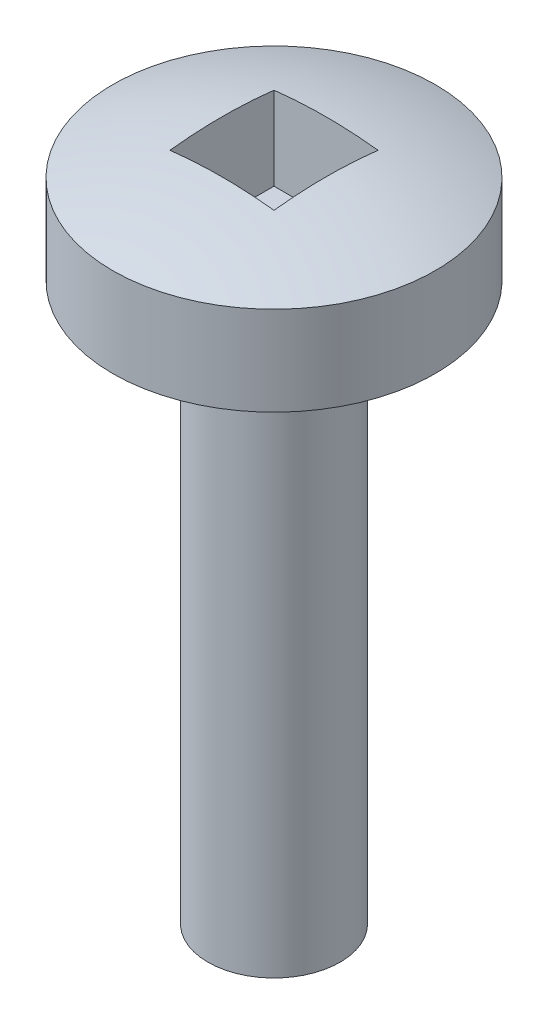
ISO-10303-21;
HEADER;
FILE_DESCRIPTION(('STEP AP214'),'2;1');
FILE_NAME('part.step','',(''),(''),'','','');
FILE_SCHEMA(('AUTOMOTIVE_DESIGN { 1 0 10303 214 1 1 1 1 }'));
ENDSEC;
DATA;
#1=APPLICATION_CONTEXT('core data for automotive mechanical design processes');
#2=APPLICATION_PROTOCOL_DEFINITION('international standard','automotive_design',2000,#1);
#3=PRODUCT_CONTEXT('',#1,'mechanical');
#4=PRODUCT('Part','Part','',(#3));
#5=PRODUCT_RELATED_PRODUCT_CATEGORY('part','',(#4));
#6=PRODUCT_DEFINITION_FORMATION('','',#4);
#7=PRODUCT_DEFINITION_CONTEXT('part definition',#1,'design');
#8=PRODUCT_DEFINITION('design','',#6,#7);
#9=PRODUCT_DEFINITION_SHAPE('','',#8);
#10=(LENGTH_UNIT() NAMED_UNIT(*) SI_UNIT(.MILLI.,.METRE.));
#11=(NAMED_UNIT(*) PLANE_ANGLE_UNIT() SI_UNIT($,.RADIAN.));
#12=(NAMED_UNIT(*) SI_UNIT($,.STERADIAN.) SOLID_ANGLE_UNIT());
#13=UNCERTAINTY_MEASURE_WITH_UNIT(LENGTH_MEASURE(1.E-05),#10,'distance_accuracy_value','');
#14=(GEOMETRIC_REPRESENTATION_CONTEXT(3) GLOBAL_UNCERTAINTY_ASSIGNED_CONTEXT((#13)) GLOBAL_UNIT_ASSIGNED_CONTEXT((#10,
#11,#12)) REPRESENTATION_CONTEXT('',''));
#15=CARTESIAN_POINT('',(0.,0.,0.));
#16=DIRECTION('',(0.,0.,1.));
#17=DIRECTION('',(1.,0.,0.));
#18=AXIS2_PLACEMENT_3D('',#15,#16,#17);
#19=CARTESIAN_POINT('',(0.,-9.525,0.));
#20=DIRECTION('',(0.,1.,0.));
#21=DIRECTION('',(0.,0.,1.));
#22=AXIS2_PLACEMENT_3D('',#19,#20,#21);
#23=CYLINDRICAL_SURFACE('',#22,1.1303);
#24=CARTESIAN_POINT('',(0.,-9.525,0.));
#25=DIRECTION('',(0.,1.,0.));
#26=DIRECTION('',(0.,0.,1.));
#27=AXIS2_PLACEMENT_3D('',#24,#25,#26);
#28=CIRCLE('',#27,1.1303);
#29=CARTESIAN_POINT('',(0.,-9.525,1.1303));
#30=VERTEX_POINT('',#29);
#31=EDGE_CURVE('E104',#30,#30,#28,.T.);
#32=CARTESIAN_POINT('',(0.,0.,0.));
#33=DIRECTION('',(0.,1.,0.));
#34=DIRECTION('',(0.,0.,1.));
#35=AXIS2_PLACEMENT_3D('',#32,#33,#34);
#36=CIRCLE('',#35,1.1303);
#37=CARTESIAN_POINT('',(0.,0.,1.1303));
#38=VERTEX_POINT('',#37);
#39=EDGE_CURVE('E108',#38,#38,#36,.T.);
#40=CARTESIAN_POINT('',(0.,-9.525,1.1303));
#41=CARTESIAN_POINT('',(0.,-9.42578125,1.1303));
#42=CARTESIAN_POINT('',(0.,-9.3265625,1.1303));
#43=CARTESIAN_POINT('',(0.,-9.128125,1.1303));
#44=CARTESIAN_POINT('',(0.,-9.02890625,1.1303));
#45=CARTESIAN_POINT('',(0.,-8.83046875,1.1303));
#46=CARTESIAN_POINT('',(0.,-8.73125,1.1303));
#47=CARTESIAN_POINT('',(0.,-8.5328125,1.1303));
#48=CARTESIAN_POINT('',(0.,-8.43359375,1.1303));
#49=CARTESIAN_POINT('',(0.,-8.23515625,1.1303));
#50=CARTESIAN_POINT('',(0.,-8.1359375,1.1303));
#51=CARTESIAN_POINT('',(0.,-7.9375,1.1303));
#52=CARTESIAN_POINT('',(0.,-7.83828125,1.1303));
#53=CARTESIAN_POINT('',(0.,-7.63984375,1.1303));
#54=CARTESIAN_POINT('',(0.,-7.540625,1.1303));
#55=CARTESIAN_POINT('',(0.,-7.3421875,1.1303));
#56=CARTESIAN_POINT('',(0.,-7.24296875,1.1303));
#57=CARTESIAN_POINT('',(0.,-7.04453125,1.1303));
#58=CARTESIAN_POINT('',(0.,-6.9453125,1.1303));
#59=CARTESIAN_POINT('',(0.,-6.746875,1.1303));
#60=CARTESIAN_POINT('',(0.,-6.64765625,1.1303));
#61=CARTESIAN_POINT('',(0.,-6.44921875,1.1303));
#62=CARTESIAN_POINT('',(0.,-6.35,1.1303));
#63=CARTESIAN_POINT('',(0.,-6.1515625,1.1303));
#64=CARTESIAN_POINT('',(0.,-6.05234375,1.1303));
#65=CARTESIAN_POINT('',(0.,-5.85390625,1.1303));
#66=CARTESIAN_POINT('',(0.,-5.7546875,1.1303));
#67=CARTESIAN_POINT('',(0.,-5.55625,1.1303));
#68=CARTESIAN_POINT('',(0.,-5.45703125,1.1303));
#69=CARTESIAN_POINT('',(0.,-5.25859375,1.1303));
#70=CARTESIAN_POINT('',(0.,-5.159375,1.1303));
#71=CARTESIAN_POINT('',(0.,-4.9609375,1.1303));
#72=CARTESIAN_POINT('',(0.,-4.86171875,1.1303));
#73=CARTESIAN_POINT('',(0.,-4.66328125,1.1303));
#74=CARTESIAN_POINT('',(0.,-4.5640625,1.1303));
#75=CARTESIAN_POINT('',(0.,-4.365625,1.1303));
#76=CARTESIAN_POINT('',(0.,-4.26640625,1.1303));
#77=CARTESIAN_POINT('',(0.,-4.06796875,1.1303));
#78=CARTESIAN_POINT('',(0.,-3.96875,1.1303));
#79=CARTESIAN_POINT('',(0.,-3.7703125,1.1303));
#80=CARTESIAN_POINT('',(0.,-3.67109375,1.1303));
#81=CARTESIAN_POINT('',(0.,-3.47265625,1.1303));
#82=CARTESIAN_POINT('',(0.,-3.3734375,1.1303));
#83=CARTESIAN_POINT('',(0.,-3.175,1.1303));
#84=CARTESIAN_POINT('',(0.,-3.07578125,1.1303));
#85=CARTESIAN_POINT('',(0.,-2.87734375,1.1303));
#86=CARTESIAN_POINT('',(0.,-2.778125,1.1303));
#87=CARTESIAN_POINT('',(0.,-2.5796875,1.1303));
#88=CARTESIAN_POINT('',(0.,-2.48046875,1.1303));
#89=CARTESIAN_POINT('',(0.,-2.28203125,1.1303));
#90=CARTESIAN_POINT('',(0.,-2.1828125,1.1303));
#91=CARTESIAN_POINT('',(0.,-1.984375,1.1303));
#92=CARTESIAN_POINT('',(0.,-1.88515625,1.1303));
#93=CARTESIAN_POINT('',(0.,-1.68671875,1.1303));
#94=CARTESIAN_POINT('',(0.,-1.5875,1.1303));
#95=CARTESIAN_POINT('',(0.,-1.3890625,1.1303));
#96=CARTESIAN_POINT('',(0.,-1.28984375,1.1303));
#97=CARTESIAN_POINT('',(0.,-1.09140625,1.1303));
#98=CARTESIAN_POINT('',(0.,-0.992187500000001,1.1303));
#99=CARTESIAN_POINT('',(0.,-0.793750000000001,1.1303));
#100=CARTESIAN_POINT('',(0.,-0.69453125,1.1303));
#101=CARTESIAN_POINT('',(0.,-0.49609375,1.1303));
#102=CARTESIAN_POINT('',(0.,-0.396875,1.1303));
#103=CARTESIAN_POINT('',(0.,-0.1984375,1.1303));
#104=CARTESIAN_POINT('',(0.,-0.0992187500000001,1.1303));
#105=CARTESIAN_POINT('',(0.,0.,1.1303));
#106=B_SPLINE_CURVE_WITH_KNOTS('',3,(#40,#41,#42,#43,#44,#45,#46,#47,#48,#49,#50,#51,#52,#53,
#54,#55,#56,#57,#58,#59,#60,#61,#62,#63,#64,#65,#66,#67,#68,#69,#70,#71,#72,#73,#74,#75,#76,#77,
#78,#79,#80,#81,#82,#83,#84,#85,#86,#87,#88,#89,#90,#91,#92,#93,#94,#95,#96,#97,#98,#99,#100,
#101,#102,#103,#104,#105),.UNSPECIFIED.,.F.,.F.,(4,2,2,2,2,2,2,2,2,2,2,2,2,2,2,2,2,2,2,2,2,2,2,
2,2,2,2,2,2,2,2,2,4),(0.,0.29765625,0.5953125,0.892968750000001,1.190625,1.48828125,1.7859375,
2.08359375,2.38125,2.67890625,2.9765625,3.27421875,3.571875,3.86953125,4.1671875,4.46484375,
4.7625,5.06015625,5.3578125,5.65546875,5.953125,6.25078125,6.5484375,6.84609375,7.14375,
7.44140625,7.7390625,8.03671875,8.334375,8.63203125,8.9296875,9.22734375,9.525),.UNSPECIFIED.);
#107=EDGE_CURVE('BSEAM32',#30,#38,#106,.T.);
#108=ORIENTED_EDGE('',*,*,#31,.T.);
#109=ORIENTED_EDGE('',*,*,#39,.F.);
#110=ORIENTED_EDGE('',*,*,#107,.T.);
#111=ORIENTED_EDGE('',*,*,#107,.F.);
#112=EDGE_LOOP('',(#108,#110,#109,#111));
#113=FACE_BOUND('',#112,.T.);
#114=ADVANCED_FACE('F32',(#113),#23,.T.);
#115=CARTESIAN_POINT('',(0.,-9.525,0.));
#116=DIRECTION('',(0.,1.,0.));
#117=DIRECTION('',(0.,0.,1.));
#118=AXIS2_PLACEMENT_3D('',#115,#116,#117);
#119=PLANE('',#118);
#120=ORIENTED_EDGE('',*,*,#31,.F.);
#121=EDGE_LOOP('',(#120));
#122=FACE_BOUND('',#121,.T.);
#123=ADVANCED_FACE('F128',(#122),#119,.F.);
#124=CARTESIAN_POINT('',(0.,1.524,0.));
#125=DIRECTION('',(0.,-1.,0.));
#126=DIRECTION('',(0.,0.,-1.));
#127=AXIS2_PLACEMENT_3D('',#124,#125,#126);
#128=CYLINDRICAL_SURFACE('',#127,2.7559);
#129=CARTESIAN_POINT('',(0.,1.524,0.));
#130=DIRECTION('',(0.,1.,0.));
#131=DIRECTION('',(0.,0.,1.));
#132=AXIS2_PLACEMENT_3D('',#129,#130,#131);
#133=CIRCLE('',#132,2.7559);
#134=CARTESIAN_POINT('',(0.,1.524,-2.7559));
#135=VERTEX_POINT('',#134);
#136=EDGE_CURVE('E103',#135,#135,#133,.T.);
#137=CARTESIAN_POINT('',(0.,0.,0.));
#138=DIRECTION('',(0.,1.,0.));
#139=DIRECTION('',(0.,0.,1.));
#140=AXIS2_PLACEMENT_3D('',#137,#138,#139);
#141=CIRCLE('',#140,2.7559);
#142=CARTESIAN_POINT('',(0.,0.,-2.7559));
#143=VERTEX_POINT('',#142);
#144=EDGE_CURVE('E97',#143,#143,#141,.T.);
#145=CARTESIAN_POINT('',(0.,1.524,-2.7559));
#146=CARTESIAN_POINT('',(0.,1.508125,-2.7559));
#147=CARTESIAN_POINT('',(0.,1.49225,-2.7559));
#148=CARTESIAN_POINT('',(0.,1.4605,-2.7559));
#149=CARTESIAN_POINT('',(0.,1.444625,-2.7559));
#150=CARTESIAN_POINT('',(0.,1.412875,-2.7559));
#151=CARTESIAN_POINT('',(0.,1.397,-2.7559));
#152=CARTESIAN_POINT('',(0.,1.36525,-2.7559));
#153=CARTESIAN_POINT('',(0.,1.349375,-2.7559));
#154=CARTESIAN_POINT('',(0.,1.317625,-2.7559));
#155=CARTESIAN_POINT('',(0.,1.30175,-2.7559));
#156=CARTESIAN_POINT('',(0.,1.27,-2.7559));
#157=CARTESIAN_POINT('',(0.,1.254125,-2.7559));
#158=CARTESIAN_POINT('',(0.,1.222375,-2.7559));
#159=CARTESIAN_POINT('',(0.,1.2065,-2.7559));
#160=CARTESIAN_POINT('',(0.,1.17475,-2.7559));
#161=CARTESIAN_POINT('',(0.,1.158875,-2.7559));
#162=CARTESIAN_POINT('',(0.,1.127125,-2.7559));
#163=CARTESIAN_POINT('',(0.,1.11125,-2.7559));
#164=CARTESIAN_POINT('',(0.,1.0795,-2.7559));
#165=CARTESIAN_POINT('',(0.,1.063625,-2.7559));
#166=CARTESIAN_POINT('',(0.,1.031875,-2.7559));
#167=CARTESIAN_POINT('',(0.,1.016,-2.7559));
#168=CARTESIAN_POINT('',(0.,0.98425,-2.7559));
#169=CARTESIAN_POINT('',(0.,0.968375,-2.7559));
#170=CARTESIAN_POINT('',(0.,0.936625,-2.7559));
#171=CARTESIAN_POINT('',(0.,0.92075,-2.7559));
#172=CARTESIAN_POINT('',(0.,0.889,-2.7559));
#173=CARTESIAN_POINT('',(0.,0.873125,-2.7559));
#174=CARTESIAN_POINT('',(0.,0.841375,-2.7559));
#175=CARTESIAN_POINT('',(0.,0.8255,-2.7559));
#176=CARTESIAN_POINT('',(0.,0.79375,-2.7559));
#177=CARTESIAN_POINT('',(0.,0.777875,-2.7559));
#178=CARTESIAN_POINT('',(0.,0.746125,-2.7559));
#179=CARTESIAN_POINT('',(0.,0.73025,-2.7559));
#180=CARTESIAN_POINT('',(0.,0.6985,-2.7559));
#181=CARTESIAN_POINT('',(0.,0.682625,-2.7559));
#182=CARTESIAN_POINT('',(0.,0.650875,-2.7559));
#183=CARTESIAN_POINT('',(0.,0.635,-2.7559));
#184=CARTESIAN_POINT('',(0.,0.60325,-2.7559));
#185=CARTESIAN_POINT('',(0.,0.587375,-2.7559));
#186=CARTESIAN_POINT('',(0.,0.555625,-2.7559));
#187=CARTESIAN_POINT('',(0.,0.53975,-2.7559));
#188=CARTESIAN_POINT('',(0.,0.508,-2.7559));
#189=CARTESIAN_POINT('',(0.,0.492125,-2.7559));
#190=CARTESIAN_POINT('',(0.,0.460375,-2.7559));
#191=CARTESIAN_POINT('',(0.,0.4445,-2.7559));
#192=CARTESIAN_POINT('',(0.,0.41275,-2.7559));
#193=CARTESIAN_POINT('',(0.,0.396875,-2.7559));
#194=CARTESIAN_POINT('',(0.,0.365125,-2.7559));
#195=CARTESIAN_POINT('',(0.,0.34925,-2.7559));
#196=CARTESIAN_POINT('',(0.,0.3175,-2.7559));
#197=CARTESIAN_POINT('',(0.,0.301625,-2.7559));
#198=CARTESIAN_POINT('',(0.,0.269875,-2.7559));
#199=CARTESIAN_POINT('',(0.,0.254,-2.7559));
#200=CARTESIAN_POINT('',(0.,0.22225,-2.7559));
#201=CARTESIAN_POINT('',(0.,0.206375,-2.7559));
#202=CARTESIAN_POINT('',(0.,0.174625,-2.7559));
#203=CARTESIAN_POINT('',(0.,0.15875,-2.7559));
#204=CARTESIAN_POINT('',(0.,0.127,-2.7559));
#205=CARTESIAN_POINT('',(0.,0.111125,-2.7559));
#206=CARTESIAN_POINT('',(0.,0.079375,-2.7559));
#207=CARTESIAN_POINT('',(0.,0.0635,-2.7559));
#208=CARTESIAN_POINT('',(0.,0.0317499999999999,-2.7559));
#209=CARTESIAN_POINT('',(0.,0.015875,-2.7559));
#210=CARTESIAN_POINT('',(0.,0.,-2.7559));
#211=B_SPLINE_CURVE_WITH_KNOTS('',3,(#145,#146,#147,#148,#149,#150,#151,#152,#153,#154,#155,
#156,#157,#158,#159,#160,#161,#162,#163,#164,#165,#166,#167,#168,#169,#170,#171,#172,#173,#174,
#175,#176,#177,#178,#179,#180,#181,#182,#183,#184,#185,#186,#187,#188,#189,#190,#191,#192,#193,
#194,#195,#196,#197,#198,#199,#200,#201,#202,#203,#204,#205,#206,#207,#208,#209,#210),
.UNSPECIFIED.,.F.,.F.,(4,2,2,2,2,2,2,2,2,2,2,2,2,2,2,2,2,2,2,2,2,2,2,2,2,2,2,2,2,2,2,2,4),(0.,
0.0476250000000001,0.0952500000000001,0.142875,0.1905,0.238125,0.28575,0.333375,0.381,0.428625,
0.47625,0.523875,0.5715,0.619125,0.66675,0.714375,0.762,0.809625,0.85725,0.904875,0.9525,
1.000125,1.04775,1.095375,1.143,1.190625,1.23825,1.285875,1.3335,1.381125,1.42875,1.476375,
1.524),.UNSPECIFIED.);
#212=EDGE_CURVE('BSEAM123',#135,#143,#211,.T.);
#213=ORIENTED_EDGE('',*,*,#136,.F.);
#214=ORIENTED_EDGE('',*,*,#144,.T.);
#215=ORIENTED_EDGE('',*,*,#212,.T.);
#216=ORIENTED_EDGE('',*,*,#212,.F.);
#217=EDGE_LOOP('',(#213,#215,#214,#216));
#218=FACE_BOUND('',#217,.T.);
#219=ADVANCED_FACE('F123',(#218),#128,.T.);
#220=CARTESIAN_POINT('',(0.,-5.69737875,0.));
#221=DIRECTION('',(0.,0.,1.));
#222=DIRECTION('',(1.,0.,0.));
#223=AXIS2_PLACEMENT_3D('',#220,#221,#222);
#224=SPHERICAL_SURFACE('',#223,7.72937875);
#225=CARTESIAN_POINT('',(0.889,-5.69737875,0.));
#226=DIRECTION('',(1.,0.,0.));
#227=DIRECTION('',(0.,0.,-1.));
#228=AXIS2_PLACEMENT_3D('',#225,#226,#227);
#229=CIRCLE('',#228,7.67808406185759);
#230=CARTESIAN_POINT('',(0.889,1.92906562867028,0.889));
#231=VERTEX_POINT('',#230);
#232=CARTESIAN_POINT('',(0.889,1.92906562867028,-0.889));
#233=VERTEX_POINT('',#232);
#234=EDGE_CURVE('E11',#231,#233,#229,.F.);
#235=ORIENTED_EDGE('',*,*,#234,.F.);
#236=CARTESIAN_POINT('',(0.,-5.69737875,0.889));
#237=DIRECTION('',(0.,0.,1.));
#238=DIRECTION('',(1.,0.,0.));
#239=AXIS2_PLACEMENT_3D('',#236,#237,#238);
#240=CIRCLE('',#239,7.67808406185759);
#241=CARTESIAN_POINT('',(-0.889,1.92906562867028,0.888999999999999));
#242=VERTEX_POINT('',#241);
#243=EDGE_CURVE('E40',#242,#231,#240,.F.);
#244=ORIENTED_EDGE('',*,*,#243,.F.);
#245=CARTESIAN_POINT('',(-0.889,-5.69737875,0.));
#246=DIRECTION('',(-1.,0.,0.));
#247=DIRECTION('',(0.,0.,1.));
#248=AXIS2_PLACEMENT_3D('',#245,#246,#247);
#249=CIRCLE('',#248,7.67808406185759);
#250=CARTESIAN_POINT('',(-0.888999999999999,1.92906562867028,-0.889));
#251=VERTEX_POINT('',#250);
#252=EDGE_CURVE('E114',#251,#242,#249,.F.);
#253=ORIENTED_EDGE('',*,*,#252,.F.);
#254=CARTESIAN_POINT('',(0.,-5.69737875,-0.889));
#255=DIRECTION('',(0.,0.,-1.));
#256=DIRECTION('',(-1.,0.,0.));
#257=AXIS2_PLACEMENT_3D('',#254,#255,#256);
#258=CIRCLE('',#257,7.67808406185759);
#259=EDGE_CURVE('E107',#233,#251,#258,.F.);
#260=ORIENTED_EDGE('',*,*,#259,.F.);
#261=EDGE_LOOP('',(#235,#244,#253,#260));
#262=FACE_BOUND('',#261,.T.);
#263=ORIENTED_EDGE('',*,*,#136,.T.);
#264=EDGE_LOOP('',(#263));
#265=FACE_BOUND('',#264,.T.);
#266=ADVANCED_FACE('F34',(#262,#265),#224,.T.);
#267=CARTESIAN_POINT('',(0.,0.,0.));
#268=DIRECTION('',(0.,1.,0.));
#269=DIRECTION('',(0.,0.,1.));
#270=AXIS2_PLACEMENT_3D('',#267,#268,#269);
#271=PLANE('',#270);
#272=ORIENTED_EDGE('',*,*,#39,.T.);
#273=EDGE_LOOP('',(#272));
#274=FACE_BOUND('',#273,.T.);
#275=ORIENTED_EDGE('',*,*,#144,.F.);
#276=EDGE_LOOP('',(#275));
#277=FACE_BOUND('',#276,.T.);
#278=ADVANCED_FACE('F122',(#274,#277),#271,.F.);
#279=CARTESIAN_POINT('',(0.889,0.508,0.889));
#280=DIRECTION('',(1.,0.,0.));
#281=DIRECTION('',(0.,0.,-1.));
#282=AXIS2_PLACEMENT_3D('',#279,#280,#281);
#283=PLANE('',#282);
#284=ORIENTED_EDGE('',*,*,#234,.T.);
#285=DIRECTION('',(0.,1.,0.));
#286=VECTOR('',#285,1.);
#287=CARTESIAN_POINT('',(0.889,0.508,-0.889));
#288=LINE('',#287,#286);
#289=CARTESIAN_POINT('',(0.889,0.508,-0.889));
#290=VERTEX_POINT('',#289);
#291=EDGE_CURVE('E47',#290,#233,#288,.T.);
#292=ORIENTED_EDGE('',*,*,#291,.F.);
#293=DIRECTION('',(0.,0.,-1.));
#294=VECTOR('',#293,1.);
#295=CARTESIAN_POINT('',(0.889,0.508,0.889));
#296=LINE('',#295,#294);
#297=CARTESIAN_POINT('',(0.889,0.508,0.889));
#298=VERTEX_POINT('',#297);
#299=EDGE_CURVE('E73',#298,#290,#296,.T.);
#300=ORIENTED_EDGE('',*,*,#299,.F.);
#301=DIRECTION('',(0.,1.,0.));
#302=VECTOR('',#301,1.);
#303=CARTESIAN_POINT('',(0.889,0.508,0.889));
#304=LINE('',#303,#302);
#305=EDGE_CURVE('E95',#298,#231,#304,.T.);
#306=ORIENTED_EDGE('',*,*,#305,.T.);
#307=EDGE_LOOP('',(#284,#292,#300,#306));
#308=FACE_BOUND('',#307,.T.);
#309=ADVANCED_FACE('F71',(#308),#283,.F.);
#310=CARTESIAN_POINT('',(-0.889,0.508,0.889));
#311=DIRECTION('',(0.,0.,1.));
#312=DIRECTION('',(1.,0.,0.));
#313=AXIS2_PLACEMENT_3D('',#310,#311,#312);
#314=PLANE('',#313);
#315=ORIENTED_EDGE('',*,*,#243,.T.);
#316=ORIENTED_EDGE('',*,*,#305,.F.);
#317=DIRECTION('',(1.,0.,0.));
#318=VECTOR('',#317,1.);
#319=CARTESIAN_POINT('',(-0.889,0.508,0.889));
#320=LINE('',#319,#318);
#321=CARTESIAN_POINT('',(-0.889,0.508,0.889));
#322=VERTEX_POINT('',#321);
#323=EDGE_CURVE('E78',#322,#298,#320,.T.);
#324=ORIENTED_EDGE('',*,*,#323,.F.);
#325=DIRECTION('',(0.,1.,0.));
#326=VECTOR('',#325,1.);
#327=CARTESIAN_POINT('',(-0.889,0.508,0.889));
#328=LINE('',#327,#326);
#329=EDGE_CURVE('E98',#322,#242,#328,.T.);
#330=ORIENTED_EDGE('',*,*,#329,.T.);
#331=EDGE_LOOP('',(#315,#316,#324,#330));
#332=FACE_BOUND('',#331,.T.);
#333=ADVANCED_FACE('F119',(#332),#314,.F.);
#334=CARTESIAN_POINT('',(-0.889,0.508,0.889));
#335=DIRECTION('',(-1.,0.,0.));
#336=DIRECTION('',(0.,0.,1.));
#337=AXIS2_PLACEMENT_3D('',#334,#335,#336);
#338=PLANE('',#337);
#339=ORIENTED_EDGE('',*,*,#252,.T.);
#340=ORIENTED_EDGE('',*,*,#329,.F.);
#341=DIRECTION('',(0.,0.,1.));
#342=VECTOR('',#341,1.);
#343=CARTESIAN_POINT('',(-0.889,0.508,0.889));
#344=LINE('',#343,#342);
#345=CARTESIAN_POINT('',(-0.889,0.508,-0.889));
#346=VERTEX_POINT('',#345);
#347=EDGE_CURVE('E87',#346,#322,#344,.T.);
#348=ORIENTED_EDGE('',*,*,#347,.F.);
#349=DIRECTION('',(0.,1.,0.));
#350=VECTOR('',#349,1.);
#351=CARTESIAN_POINT('',(-0.889,0.508,-0.889));
#352=LINE('',#351,#350);
#353=EDGE_CURVE('E77',#346,#251,#352,.T.);
#354=ORIENTED_EDGE('',*,*,#353,.T.);
#355=EDGE_LOOP('',(#339,#340,#348,#354));
#356=FACE_BOUND('',#355,.T.);
#357=ADVANCED_FACE('F117',(#356),#338,.F.);
#358=CARTESIAN_POINT('',(-0.889,0.508,-0.889));
#359=DIRECTION('',(0.,0.,-1.));
#360=DIRECTION('',(-1.,0.,0.));
#361=AXIS2_PLACEMENT_3D('',#358,#359,#360);
#362=PLANE('',#361);
#363=ORIENTED_EDGE('',*,*,#259,.T.);
#364=ORIENTED_EDGE('',*,*,#353,.F.);
#365=DIRECTION('',(-1.,0.,0.));
#366=VECTOR('',#365,1.);
#367=CARTESIAN_POINT('',(-0.889,0.508,-0.889));
#368=LINE('',#367,#366);
#369=EDGE_CURVE('E81',#290,#346,#368,.T.);
#370=ORIENTED_EDGE('',*,*,#369,.F.);
#371=ORIENTED_EDGE('',*,*,#291,.T.);
#372=EDGE_LOOP('',(#363,#364,#370,#371));
#373=FACE_BOUND('',#372,.T.);
#374=ADVANCED_FACE('F82',(#373),#362,.F.);
#375=CARTESIAN_POINT('',(0.,0.508,0.));
#376=DIRECTION('',(0.,-1.,0.));
#377=DIRECTION('',(0.,0.,-1.));
#378=AXIS2_PLACEMENT_3D('',#375,#376,#377);
#379=PLANE('',#378);
#380=ORIENTED_EDGE('',*,*,#299,.T.);
#381=ORIENTED_EDGE('',*,*,#369,.T.);
#382=ORIENTED_EDGE('',*,*,#347,.T.);
#383=ORIENTED_EDGE('',*,*,#323,.T.);
#384=EDGE_LOOP('',(#380,#381,#382,#383));
#385=FACE_BOUND('',#384,.T.);
#386=ADVANCED_FACE('F89',(#385),#379,.F.);
#387=CLOSED_SHELL('',(#114,#123,#219,#266,#278,#309,#333,#357,#374,#386));
#388=MANIFOLD_SOLID_BREP('B2',#387);
#389=ADVANCED_BREP_SHAPE_REPRESENTATION('',(#18,#388),#14);
#390=SHAPE_DEFINITION_REPRESENTATION(#9,#389);
ENDSEC;
END-ISO-10303-21;
